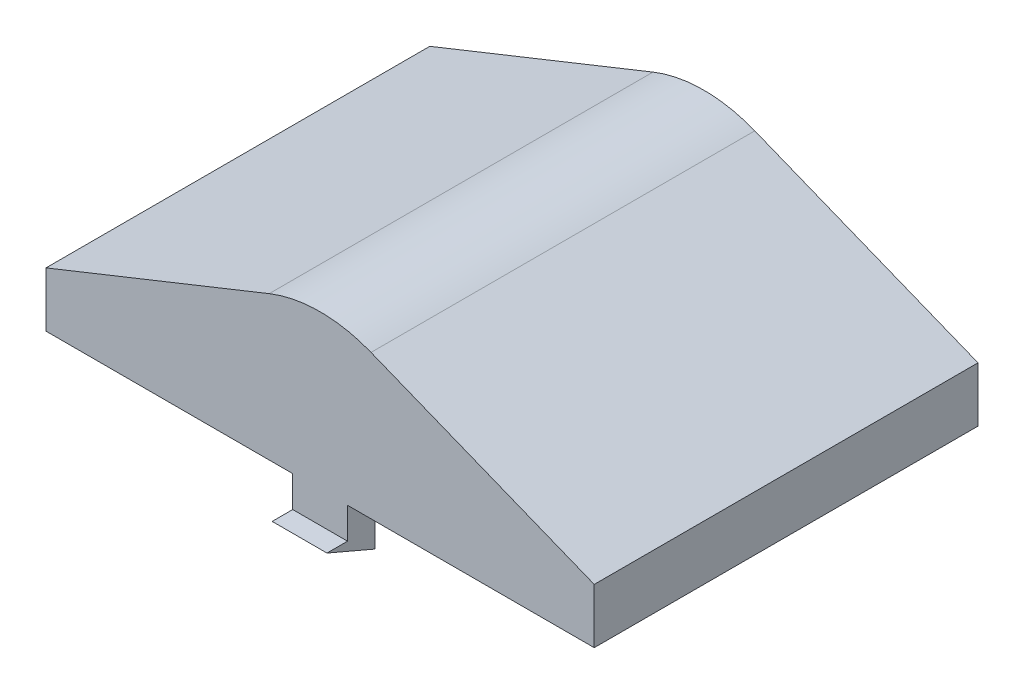
ISO-10303-21;
HEADER;
FILE_DESCRIPTION(('STEP AP214'),'2;1');
FILE_NAME('part.step','',(''),(''),'','','');
FILE_SCHEMA(('AUTOMOTIVE_DESIGN { 1 0 10303 214 1 1 1 1 }'));
ENDSEC;
DATA;
#1=APPLICATION_CONTEXT('core data for automotive mechanical design processes');
#2=APPLICATION_PROTOCOL_DEFINITION('international standard','automotive_design',2000,#1);
#3=PRODUCT_CONTEXT('',#1,'mechanical');
#4=PRODUCT('Part','Part','',(#3));
#5=PRODUCT_RELATED_PRODUCT_CATEGORY('part','',(#4));
#6=PRODUCT_DEFINITION_FORMATION('','',#4);
#7=PRODUCT_DEFINITION_CONTEXT('part definition',#1,'design');
#8=PRODUCT_DEFINITION('design','',#6,#7);
#9=PRODUCT_DEFINITION_SHAPE('','',#8);
#10=(LENGTH_UNIT() NAMED_UNIT(*) SI_UNIT(.MILLI.,.METRE.));
#11=(NAMED_UNIT(*) PLANE_ANGLE_UNIT() SI_UNIT($,.RADIAN.));
#12=(NAMED_UNIT(*) SI_UNIT($,.STERADIAN.) SOLID_ANGLE_UNIT());
#13=UNCERTAINTY_MEASURE_WITH_UNIT(LENGTH_MEASURE(1.E-05),#10,'distance_accuracy_value','');
#14=(GEOMETRIC_REPRESENTATION_CONTEXT(3) GLOBAL_UNCERTAINTY_ASSIGNED_CONTEXT((#13)) GLOBAL_UNIT_ASSIGNED_CONTEXT((#10,
#11,#12)) REPRESENTATION_CONTEXT('',''));
#15=CARTESIAN_POINT('',(0.,0.,0.));
#16=DIRECTION('',(0.,0.,1.));
#17=DIRECTION('',(1.,0.,0.));
#18=AXIS2_PLACEMENT_3D('',#15,#16,#17);
#19=CARTESIAN_POINT('',(-10.,0.,7.));
#20=DIRECTION('',(0.,1.,0.));
#21=DIRECTION('',(-1.,0.,0.));
#22=AXIS2_PLACEMENT_3D('',#19,#20,#21);
#23=PLANE('',#22);
#24=DIRECTION('',(0.,0.,-1.));
#25=VECTOR('',#24,1.);
#26=CARTESIAN_POINT('',(-0.999999999999994,0.,-6.));
#27=LINE('',#26,#25);
#28=CARTESIAN_POINT('',(-0.999999999999994,0.,-6.));
#29=VERTEX_POINT('',#28);
#30=CARTESIAN_POINT('',(-0.999999999999999,0.,-7.));
#31=VERTEX_POINT('',#30);
#32=EDGE_CURVE('E203',#29,#31,#27,.T.);
#33=ORIENTED_EDGE('',*,*,#32,.F.);
#34=DIRECTION('',(1.,0.,0.));
#35=VECTOR('',#34,1.);
#36=CARTESIAN_POINT('',(10.,0.,-6.));
#37=LINE('',#36,#35);
#38=CARTESIAN_POINT('',(-8.99999999999999,0.,-6.));
#39=VERTEX_POINT('',#38);
#40=EDGE_CURVE('E281',#39,#29,#37,.T.);
#41=ORIENTED_EDGE('',*,*,#40,.F.);
#42=DIRECTION('',(0.,0.,-1.));
#43=VECTOR('',#42,1.);
#44=CARTESIAN_POINT('',(-9.,0.,7.));
#45=LINE('',#44,#43);
#46=CARTESIAN_POINT('',(-9.,0.,6.));
#47=VERTEX_POINT('',#46);
#48=EDGE_CURVE('E304',#47,#39,#45,.T.);
#49=ORIENTED_EDGE('',*,*,#48,.F.);
#50=DIRECTION('',(1.,0.,0.));
#51=VECTOR('',#50,1.);
#52=CARTESIAN_POINT('',(10.,0.,6.));
#53=LINE('',#52,#51);
#54=CARTESIAN_POINT('',(-0.999999999999997,0.,6.));
#55=VERTEX_POINT('',#54);
#56=EDGE_CURVE('E310',#47,#55,#53,.T.);
#57=ORIENTED_EDGE('',*,*,#56,.T.);
#58=DIRECTION('',(0.,0.,1.));
#59=VECTOR('',#58,1.);
#60=CARTESIAN_POINT('',(-0.999999999999996,0.,6.));
#61=LINE('',#60,#59);
#62=CARTESIAN_POINT('',(-1.,0.,7.));
#63=VERTEX_POINT('',#62);
#64=EDGE_CURVE('E248',#55,#63,#61,.T.);
#65=ORIENTED_EDGE('',*,*,#64,.T.);
#66=DIRECTION('',(1.,0.,0.));
#67=VECTOR('',#66,1.);
#68=CARTESIAN_POINT('',(-10.,0.,7.));
#69=LINE('',#68,#67);
#70=CARTESIAN_POINT('',(-10.,0.,7.));
#71=VERTEX_POINT('',#70);
#72=EDGE_CURVE('E319',#71,#63,#69,.T.);
#73=ORIENTED_EDGE('',*,*,#72,.F.);
#74=DIRECTION('',(0.,0.,-1.));
#75=VECTOR('',#74,1.);
#76=CARTESIAN_POINT('',(-10.,0.,7.));
#77=LINE('',#76,#75);
#78=CARTESIAN_POINT('',(-9.99999999999999,0.,-7.));
#79=VERTEX_POINT('',#78);
#80=EDGE_CURVE('E343',#71,#79,#77,.T.);
#81=ORIENTED_EDGE('',*,*,#80,.T.);
#82=DIRECTION('',(1.,0.,0.));
#83=VECTOR('',#82,1.);
#84=CARTESIAN_POINT('',(-9.99999999999999,0.,-7.));
#85=LINE('',#84,#83);
#86=EDGE_CURVE('E336',#79,#31,#85,.T.);
#87=ORIENTED_EDGE('',*,*,#86,.T.);
#88=EDGE_LOOP('',(#33,#41,#49,#57,#65,#73,#81,#87));
#89=FACE_BOUND('',#88,.T.);
#90=ADVANCED_FACE('F35',(#89),#23,.F.);
#91=CARTESIAN_POINT('',(1.00000000000001,0.,-6.));
#92=VERTEX_POINT('',#91);
#93=CARTESIAN_POINT('',(9.00000000000001,0.,-6.));
#94=VERTEX_POINT('',#93);
#95=EDGE_CURVE('E306',#92,#94,#37,.T.);
#96=ORIENTED_EDGE('',*,*,#95,.F.);
#97=DIRECTION('',(0.,0.,-1.));
#98=VECTOR('',#97,1.);
#99=CARTESIAN_POINT('',(1.00000000000001,0.,-6.));
#100=LINE('',#99,#98);
#101=CARTESIAN_POINT('',(1.00000000000001,0.,-7.));
#102=VERTEX_POINT('',#101);
#103=EDGE_CURVE('E52',#92,#102,#100,.T.);
#104=ORIENTED_EDGE('',*,*,#103,.T.);
#105=CARTESIAN_POINT('',(10.,0.,-7.));
#106=VERTEX_POINT('',#105);
#107=EDGE_CURVE('E335',#102,#106,#85,.T.);
#108=ORIENTED_EDGE('',*,*,#107,.T.);
#109=DIRECTION('',(0.,0.,-1.));
#110=VECTOR('',#109,1.);
#111=CARTESIAN_POINT('',(10.,0.,7.));
#112=LINE('',#111,#110);
#113=CARTESIAN_POINT('',(10.,0.,7.));
#114=VERTEX_POINT('',#113);
#115=EDGE_CURVE('E340',#114,#106,#112,.T.);
#116=ORIENTED_EDGE('',*,*,#115,.F.);
#117=CARTESIAN_POINT('',(1.,0.,7.));
#118=VERTEX_POINT('',#117);
#119=EDGE_CURVE('E316',#118,#114,#69,.T.);
#120=ORIENTED_EDGE('',*,*,#119,.F.);
#121=DIRECTION('',(0.,0.,1.));
#122=VECTOR('',#121,1.);
#123=CARTESIAN_POINT('',(1.,0.,6.));
#124=LINE('',#123,#122);
#125=CARTESIAN_POINT('',(1.,0.,6.));
#126=VERTEX_POINT('',#125);
#127=EDGE_CURVE('E60',#126,#118,#124,.T.);
#128=ORIENTED_EDGE('',*,*,#127,.F.);
#129=CARTESIAN_POINT('',(9.,0.,6.));
#130=VERTEX_POINT('',#129);
#131=EDGE_CURVE('E237',#126,#130,#53,.T.);
#132=ORIENTED_EDGE('',*,*,#131,.T.);
#133=DIRECTION('',(0.,0.,-1.));
#134=VECTOR('',#133,1.);
#135=CARTESIAN_POINT('',(9.,0.,7.));
#136=LINE('',#135,#134);
#137=EDGE_CURVE('E308',#130,#94,#136,.T.);
#138=ORIENTED_EDGE('',*,*,#137,.T.);
#139=EDGE_LOOP('',(#96,#104,#108,#116,#120,#128,#132,#138));
#140=FACE_BOUND('',#139,.T.);
#141=ADVANCED_FACE('F412',(#140),#23,.F.);
#142=CARTESIAN_POINT('',(10.,0.,7.));
#143=DIRECTION('',(-1.,0.,0.));
#144=DIRECTION('',(0.,-1.,0.));
#145=AXIS2_PLACEMENT_3D('',#142,#143,#144);
#146=PLANE('',#145);
#147=DIRECTION('',(0.,1.,0.));
#148=VECTOR('',#147,1.);
#149=CARTESIAN_POINT('',(10.,0.,-7.));
#150=LINE('',#149,#148);
#151=CARTESIAN_POINT('',(10.,1.99999999999999,-7.));
#152=VERTEX_POINT('',#151);
#153=EDGE_CURVE('E293',#106,#152,#150,.T.);
#154=ORIENTED_EDGE('',*,*,#153,.T.);
#155=DIRECTION('',(0.,0.,-1.));
#156=VECTOR('',#155,1.);
#157=CARTESIAN_POINT('',(10.,2.,7.));
#158=LINE('',#157,#156);
#159=CARTESIAN_POINT('',(10.,2.,7.));
#160=VERTEX_POINT('',#159);
#161=EDGE_CURVE('E349',#160,#152,#158,.T.);
#162=ORIENTED_EDGE('',*,*,#161,.F.);
#163=DIRECTION('',(0.,1.,0.));
#164=VECTOR('',#163,1.);
#165=CARTESIAN_POINT('',(10.,0.,7.));
#166=LINE('',#165,#164);
#167=EDGE_CURVE('E339',#114,#160,#166,.T.);
#168=ORIENTED_EDGE('',*,*,#167,.F.);
#169=ORIENTED_EDGE('',*,*,#115,.T.);
#170=EDGE_LOOP('',(#154,#162,#168,#169));
#171=FACE_BOUND('',#170,.T.);
#172=ADVANCED_FACE('F416',(#171),#146,.F.);
#173=CARTESIAN_POINT('',(10.,2.,7.));
#174=DIRECTION('',(-0.371390676354104,-0.928476690885259,0.));
#175=DIRECTION('',(0.928476690885259,-0.371390676354104,0.));
#176=AXIS2_PLACEMENT_3D('',#173,#174,#175);
#177=PLANE('',#176);
#178=DIRECTION('',(-0.928476690885259,0.371390676354104,0.));
#179=VECTOR('',#178,1.);
#180=CARTESIAN_POINT('',(10.,1.99999999999999,-7.));
#181=LINE('',#180,#179);
#182=CARTESIAN_POINT('',(1.85695338177052,5.25721864729179,-7.));
#183=VERTEX_POINT('',#182);
#184=EDGE_CURVE('E328',#152,#183,#181,.T.);
#185=ORIENTED_EDGE('',*,*,#184,.T.);
#186=DIRECTION('',(0.,0.,-1.));
#187=VECTOR('',#186,1.);
#188=CARTESIAN_POINT('',(1.85695338177053,5.2572186472918,7.));
#189=LINE('',#188,#187);
#190=CARTESIAN_POINT('',(1.85695338177053,5.2572186472918,7.));
#191=VERTEX_POINT('',#190);
#192=EDGE_CURVE('E44',#183,#191,#189,.F.);
#193=ORIENTED_EDGE('',*,*,#192,.T.);
#194=DIRECTION('',(-0.928476690885259,0.371390676354104,0.));
#195=VECTOR('',#194,1.);
#196=CARTESIAN_POINT('',(10.,2.,7.));
#197=LINE('',#196,#195);
#198=EDGE_CURVE('E361',#160,#191,#197,.T.);
#199=ORIENTED_EDGE('',*,*,#198,.F.);
#200=ORIENTED_EDGE('',*,*,#161,.T.);
#201=EDGE_LOOP('',(#185,#193,#199,#200));
#202=FACE_BOUND('',#201,.T.);
#203=ADVANCED_FACE('F360',(#202),#177,.F.);
#204=CARTESIAN_POINT('',(-10.,2.00000000000002,7.));
#205=DIRECTION('',(0.371390676354103,-0.92847669088526,0.));
#206=DIRECTION('',(0.92847669088526,0.371390676354103,0.));
#207=AXIS2_PLACEMENT_3D('',#204,#205,#206);
#208=PLANE('',#207);
#209=DIRECTION('',(-0.92847669088526,-0.371390676354103,0.));
#210=VECTOR('',#209,1.);
#211=CARTESIAN_POINT('',(-10.,2.00000000000002,7.));
#212=LINE('',#211,#210);
#213=CARTESIAN_POINT('',(-1.85695338177051,5.2572186472918,7.));
#214=VERTEX_POINT('',#213);
#215=CARTESIAN_POINT('',(-10.,2.00000000000002,7.));
#216=VERTEX_POINT('',#215);
#217=EDGE_CURVE('E370',#214,#216,#212,.T.);
#218=ORIENTED_EDGE('',*,*,#217,.F.);
#219=DIRECTION('',(0.,0.,-1.));
#220=VECTOR('',#219,1.);
#221=CARTESIAN_POINT('',(-1.85695338177051,5.2572186472918,7.));
#222=LINE('',#221,#220);
#223=CARTESIAN_POINT('',(-1.85695338177051,5.25721864729178,-7.));
#224=VERTEX_POINT('',#223);
#225=EDGE_CURVE('E352',#214,#224,#222,.T.);
#226=ORIENTED_EDGE('',*,*,#225,.T.);
#227=DIRECTION('',(-0.92847669088526,-0.371390676354103,0.));
#228=VECTOR('',#227,1.);
#229=CARTESIAN_POINT('',(-9.99999999999999,2.00000000000001,-7.));
#230=LINE('',#229,#228);
#231=CARTESIAN_POINT('',(-9.99999999999999,2.00000000000001,-7.));
#232=VERTEX_POINT('',#231);
#233=EDGE_CURVE('E331',#224,#232,#230,.T.);
#234=ORIENTED_EDGE('',*,*,#233,.T.);
#235=DIRECTION('',(0.,0.,-1.));
#236=VECTOR('',#235,1.);
#237=CARTESIAN_POINT('',(-10.,2.00000000000002,7.));
#238=LINE('',#237,#236);
#239=EDGE_CURVE('E346',#216,#232,#238,.T.);
#240=ORIENTED_EDGE('',*,*,#239,.F.);
#241=EDGE_LOOP('',(#218,#226,#234,#240));
#242=FACE_BOUND('',#241,.T.);
#243=ADVANCED_FACE('F375',(#242),#208,.F.);
#244=CARTESIAN_POINT('',(-10.,0.,7.));
#245=DIRECTION('',(1.,0.,0.));
#246=DIRECTION('',(0.,1.,0.));
#247=AXIS2_PLACEMENT_3D('',#244,#245,#246);
#248=PLANE('',#247);
#249=DIRECTION('',(0.,-1.,0.));
#250=VECTOR('',#249,1.);
#251=CARTESIAN_POINT('',(-9.99999999999999,0.,-7.));
#252=LINE('',#251,#250);
#253=EDGE_CURVE('E333',#232,#79,#252,.T.);
#254=ORIENTED_EDGE('',*,*,#253,.T.);
#255=ORIENTED_EDGE('',*,*,#80,.F.);
#256=DIRECTION('',(0.,-1.,0.));
#257=VECTOR('',#256,1.);
#258=CARTESIAN_POINT('',(-10.,0.,7.));
#259=LINE('',#258,#257);
#260=EDGE_CURVE('E320',#216,#71,#259,.T.);
#261=ORIENTED_EDGE('',*,*,#260,.F.);
#262=ORIENTED_EDGE('',*,*,#239,.T.);
#263=EDGE_LOOP('',(#254,#255,#261,#262));
#264=FACE_BOUND('',#263,.T.);
#265=ADVANCED_FACE('F383',(#264),#248,.F.);
#266=CARTESIAN_POINT('',(10.,0.,7.));
#267=DIRECTION('',(0.,0.,-1.));
#268=DIRECTION('',(-1.,0.,0.));
#269=AXIS2_PLACEMENT_3D('',#266,#267,#268);
#270=PLANE('',#269);
#271=ORIENTED_EDGE('',*,*,#198,.T.);
#272=CARTESIAN_POINT('',(0.,0.614835192865495,7.));
#273=DIRECTION('',(0.,0.,-1.));
#274=DIRECTION('',(-1.,0.,0.));
#275=AXIS2_PLACEMENT_3D('',#272,#273,#274);
#276=CIRCLE('',#275,5.);
#277=EDGE_CURVE('E11',#191,#214,#276,.F.);
#278=ORIENTED_EDGE('',*,*,#277,.T.);
#279=ORIENTED_EDGE('',*,*,#217,.T.);
#280=ORIENTED_EDGE('',*,*,#260,.T.);
#281=ORIENTED_EDGE('',*,*,#72,.T.);
#282=DIRECTION('',(0.,-1.,0.));
#283=VECTOR('',#282,1.);
#284=CARTESIAN_POINT('',(-0.999999999999997,0.,7.));
#285=LINE('',#284,#283);
#286=CARTESIAN_POINT('',(-0.999999999999994,-1.1351648071345,7.));
#287=VERTEX_POINT('',#286);
#288=EDGE_CURVE('E251',#63,#287,#285,.T.);
#289=ORIENTED_EDGE('',*,*,#288,.T.);
#290=DIRECTION('',(-1.,0.,0.));
#291=VECTOR('',#290,1.);
#292=CARTESIAN_POINT('',(1.,-1.13516480713449,7.));
#293=LINE('',#292,#291);
#294=CARTESIAN_POINT('',(1.,-1.13516480713449,7.));
#295=VERTEX_POINT('',#294);
#296=EDGE_CURVE('E265',#295,#287,#293,.T.);
#297=ORIENTED_EDGE('',*,*,#296,.F.);
#298=DIRECTION('',(0.,-1.,0.));
#299=VECTOR('',#298,1.);
#300=CARTESIAN_POINT('',(1.,0.,7.));
#301=LINE('',#300,#299);
#302=EDGE_CURVE('E235',#118,#295,#301,.T.);
#303=ORIENTED_EDGE('',*,*,#302,.F.);
#304=ORIENTED_EDGE('',*,*,#119,.T.);
#305=ORIENTED_EDGE('',*,*,#167,.T.);
#306=EDGE_LOOP('',(#271,#278,#279,#280,#281,#289,#297,#303,#304,#305));
#307=FACE_BOUND('',#306,.T.);
#308=ADVANCED_FACE('F366',(#307),#270,.F.);
#309=CARTESIAN_POINT('',(10.,0.,-7.));
#310=DIRECTION('',(0.,0.,-1.));
#311=DIRECTION('',(-1.,0.,0.));
#312=AXIS2_PLACEMENT_3D('',#309,#310,#311);
#313=PLANE('',#312);
#314=ORIENTED_EDGE('',*,*,#233,.F.);
#315=CARTESIAN_POINT('',(0.,0.614835192865495,-7.));
#316=DIRECTION('',(0.,0.,-1.));
#317=DIRECTION('',(-1.,0.,0.));
#318=AXIS2_PLACEMENT_3D('',#315,#316,#317);
#319=CIRCLE('',#318,5.);
#320=EDGE_CURVE('E355',#224,#183,#319,.T.);
#321=ORIENTED_EDGE('',*,*,#320,.T.);
#322=ORIENTED_EDGE('',*,*,#184,.F.);
#323=ORIENTED_EDGE('',*,*,#153,.F.);
#324=ORIENTED_EDGE('',*,*,#107,.F.);
#325=DIRECTION('',(0.,-1.,0.));
#326=VECTOR('',#325,1.);
#327=CARTESIAN_POINT('',(1.00000000000001,0.,-7.));
#328=LINE('',#327,#326);
#329=CARTESIAN_POINT('',(1.00000000000001,-1.13516480713451,-7.));
#330=VERTEX_POINT('',#329);
#331=EDGE_CURVE('E208',#102,#330,#328,.T.);
#332=ORIENTED_EDGE('',*,*,#331,.T.);
#333=DIRECTION('',(-1.,0.,0.));
#334=VECTOR('',#333,1.);
#335=CARTESIAN_POINT('',(1.00000000000001,-1.13516480713451,-7.));
#336=LINE('',#335,#334);
#337=CARTESIAN_POINT('',(-0.999999999999994,-1.13516480713451,-7.));
#338=VERTEX_POINT('',#337);
#339=EDGE_CURVE('E214',#330,#338,#336,.T.);
#340=ORIENTED_EDGE('',*,*,#339,.T.);
#341=DIRECTION('',(0.,-1.,0.));
#342=VECTOR('',#341,1.);
#343=CARTESIAN_POINT('',(-0.999999999999999,0.,-7.));
#344=LINE('',#343,#342);
#345=EDGE_CURVE('E221',#31,#338,#344,.T.);
#346=ORIENTED_EDGE('',*,*,#345,.F.);
#347=ORIENTED_EDGE('',*,*,#86,.F.);
#348=ORIENTED_EDGE('',*,*,#253,.F.);
#349=EDGE_LOOP('',(#314,#321,#322,#323,#324,#332,#340,#346,#347,#348));
#350=FACE_BOUND('',#349,.T.);
#351=ADVANCED_FACE('F379',(#350),#313,.T.);
#352=CARTESIAN_POINT('',(0.,0.614835192865495,7.));
#353=DIRECTION('',(0.,0.,-1.));
#354=DIRECTION('',(-1.,0.,0.));
#355=AXIS2_PLACEMENT_3D('',#352,#353,#354);
#356=CYLINDRICAL_SURFACE('',#355,5.);
#357=ORIENTED_EDGE('',*,*,#277,.F.);
#358=ORIENTED_EDGE('',*,*,#192,.F.);
#359=ORIENTED_EDGE('',*,*,#320,.F.);
#360=ORIENTED_EDGE('',*,*,#225,.F.);
#361=EDGE_LOOP('',(#357,#358,#359,#360));
#362=FACE_BOUND('',#361,.T.);
#363=ADVANCED_FACE('F37',(#362),#356,.T.);
#364=CARTESIAN_POINT('',(9.,0.,7.));
#365=DIRECTION('',(-1.,0.,0.));
#366=DIRECTION('',(0.,-1.,0.));
#367=AXIS2_PLACEMENT_3D('',#364,#365,#366);
#368=PLANE('',#367);
#369=DIRECTION('',(0.,1.,0.));
#370=VECTOR('',#369,1.);
#371=CARTESIAN_POINT('',(9.00000000000001,0.,-6.));
#372=LINE('',#371,#370);
#373=CARTESIAN_POINT('',(9.00000000000001,1.32296703857309,-6.));
#374=VERTEX_POINT('',#373);
#375=EDGE_CURVE('E268',#94,#374,#372,.T.);
#376=ORIENTED_EDGE('',*,*,#375,.F.);
#377=ORIENTED_EDGE('',*,*,#137,.F.);
#378=DIRECTION('',(0.,1.,0.));
#379=VECTOR('',#378,1.);
#380=CARTESIAN_POINT('',(9.,0.,6.));
#381=LINE('',#380,#379);
#382=CARTESIAN_POINT('',(9.,1.3229670385731,6.));
#383=VERTEX_POINT('',#382);
#384=EDGE_CURVE('E277',#130,#383,#381,.T.);
#385=ORIENTED_EDGE('',*,*,#384,.T.);
#386=DIRECTION('',(0.,0.,-1.));
#387=VECTOR('',#386,1.);
#388=CARTESIAN_POINT('',(9.,1.3229670385731,7.));
#389=LINE('',#388,#387);
#390=EDGE_CURVE('E272',#383,#374,#389,.T.);
#391=ORIENTED_EDGE('',*,*,#390,.T.);
#392=EDGE_LOOP('',(#376,#377,#385,#391));
#393=FACE_BOUND('',#392,.T.);
#394=ADVANCED_FACE('F422',(#393),#368,.T.);
#395=CARTESIAN_POINT('',(9.6286093236459,1.07152330911474,7.));
#396=DIRECTION('',(-0.371390676354104,-0.928476690885259,0.));
#397=DIRECTION('',(0.928476690885259,-0.371390676354104,0.));
#398=AXIS2_PLACEMENT_3D('',#395,#396,#397);
#399=PLANE('',#398);
#400=DIRECTION('',(-0.928476690885259,0.371390676354104,0.));
#401=VECTOR('',#400,1.);
#402=CARTESIAN_POINT('',(10.3182644960597,0.795661240149209,-6.));
#403=LINE('',#402,#401);
#404=CARTESIAN_POINT('',(1.48556270541642,4.32874195640653,-6.));
#405=VERTEX_POINT('',#404);
#406=EDGE_CURVE('E271',#374,#405,#403,.T.);
#407=ORIENTED_EDGE('',*,*,#406,.F.);
#408=ORIENTED_EDGE('',*,*,#390,.F.);
#409=DIRECTION('',(-0.928476690885259,0.371390676354104,0.));
#410=VECTOR('',#409,1.);
#411=CARTESIAN_POINT('',(10.3182644960597,0.795661240149223,6.));
#412=LINE('',#411,#410);
#413=CARTESIAN_POINT('',(1.48556270541643,4.32874195640654,6.));
#414=VERTEX_POINT('',#413);
#415=EDGE_CURVE('E280',#383,#414,#412,.T.);
#416=ORIENTED_EDGE('',*,*,#415,.T.);
#417=DIRECTION('',(0.,0.,1.));
#418=VECTOR('',#417,1.);
#419=CARTESIAN_POINT('',(1.48556270541643,4.32874195640654,7.));
#420=LINE('',#419,#418);
#421=EDGE_CURVE('E285',#405,#414,#420,.T.);
#422=ORIENTED_EDGE('',*,*,#421,.F.);
#423=EDGE_LOOP('',(#407,#408,#416,#422));
#424=FACE_BOUND('',#423,.T.);
#425=ADVANCED_FACE('F429',(#424),#399,.T.);
#426=CARTESIAN_POINT('',(-9.6286093236459,1.07152330911476,7.));
#427=DIRECTION('',(0.371390676354103,-0.92847669088526,0.));
#428=DIRECTION('',(0.92847669088526,0.371390676354103,0.));
#429=AXIS2_PLACEMENT_3D('',#426,#427,#428);
#430=PLANE('',#429);
#431=DIRECTION('',(-0.92847669088526,-0.371390676354103,0.));
#432=VECTOR('',#431,1.);
#433=CARTESIAN_POINT('',(6.92311481428515,7.69221296428716,6.));
#434=LINE('',#433,#432);
#435=CARTESIAN_POINT('',(-1.48556270541641,4.32874195640653,6.));
#436=VERTEX_POINT('',#435);
#437=CARTESIAN_POINT('',(-8.99999999999999,1.32296703857312,6.));
#438=VERTEX_POINT('',#437);
#439=EDGE_CURVE('E291',#436,#438,#434,.T.);
#440=ORIENTED_EDGE('',*,*,#439,.T.);
#441=DIRECTION('',(0.,0.,-1.));
#442=VECTOR('',#441,1.);
#443=CARTESIAN_POINT('',(-8.99999999999999,1.32296703857312,7.));
#444=LINE('',#443,#442);
#445=CARTESIAN_POINT('',(-8.99999999999999,1.32296703857311,-6.));
#446=VERTEX_POINT('',#445);
#447=EDGE_CURVE('E276',#438,#446,#444,.T.);
#448=ORIENTED_EDGE('',*,*,#447,.T.);
#449=DIRECTION('',(-0.92847669088526,-0.371390676354103,0.));
#450=VECTOR('',#449,1.);
#451=CARTESIAN_POINT('',(6.92311481428516,7.69221296428715,-6.));
#452=LINE('',#451,#450);
#453=CARTESIAN_POINT('',(-1.48556270541641,4.32874195640653,-6.));
#454=VERTEX_POINT('',#453);
#455=EDGE_CURVE('E284',#454,#446,#452,.T.);
#456=ORIENTED_EDGE('',*,*,#455,.F.);
#457=DIRECTION('',(0.,0.,1.));
#458=VECTOR('',#457,1.);
#459=CARTESIAN_POINT('',(-1.48556270541641,4.32874195640653,7.));
#460=LINE('',#459,#458);
#461=EDGE_CURVE('E275',#436,#454,#460,.F.);
#462=ORIENTED_EDGE('',*,*,#461,.F.);
#463=EDGE_LOOP('',(#440,#448,#456,#462));
#464=FACE_BOUND('',#463,.T.);
#465=ADVANCED_FACE('F437',(#464),#430,.T.);
#466=CARTESIAN_POINT('',(-9.,0.,7.));
#467=DIRECTION('',(1.,0.,0.));
#468=DIRECTION('',(0.,1.,0.));
#469=AXIS2_PLACEMENT_3D('',#466,#467,#468);
#470=PLANE('',#469);
#471=DIRECTION('',(0.,-1.,0.));
#472=VECTOR('',#471,1.);
#473=CARTESIAN_POINT('',(-8.99999999999999,0.,-6.));
#474=LINE('',#473,#472);
#475=EDGE_CURVE('E301',#446,#39,#474,.T.);
#476=ORIENTED_EDGE('',*,*,#475,.F.);
#477=ORIENTED_EDGE('',*,*,#447,.F.);
#478=DIRECTION('',(0.,-1.,0.));
#479=VECTOR('',#478,1.);
#480=CARTESIAN_POINT('',(-9.,0.,6.));
#481=LINE('',#480,#479);
#482=EDGE_CURVE('E295',#438,#47,#481,.T.);
#483=ORIENTED_EDGE('',*,*,#482,.T.);
#484=ORIENTED_EDGE('',*,*,#48,.T.);
#485=EDGE_LOOP('',(#476,#477,#483,#484));
#486=FACE_BOUND('',#485,.T.);
#487=ADVANCED_FACE('F443',(#486),#470,.T.);
#488=CARTESIAN_POINT('',(10.,0.,6.));
#489=DIRECTION('',(0.,0.,-1.));
#490=DIRECTION('',(-1.,0.,0.));
#491=AXIS2_PLACEMENT_3D('',#488,#489,#490);
#492=PLANE('',#491);
#493=ORIENTED_EDGE('',*,*,#415,.F.);
#494=ORIENTED_EDGE('',*,*,#384,.F.);
#495=ORIENTED_EDGE('',*,*,#131,.F.);
#496=DIRECTION('',(0.,1.,0.));
#497=VECTOR('',#496,1.);
#498=CARTESIAN_POINT('',(1.,0.,6.));
#499=LINE('',#498,#497);
#500=CARTESIAN_POINT('',(1.,-1.88516480713449,6.));
#501=VERTEX_POINT('',#500);
#502=EDGE_CURVE('E236',#501,#126,#499,.T.);
#503=ORIENTED_EDGE('',*,*,#502,.F.);
#504=DIRECTION('',(-1.,0.,0.));
#505=VECTOR('',#504,1.);
#506=CARTESIAN_POINT('',(1.,-1.88516480713449,6.));
#507=LINE('',#506,#505);
#508=CARTESIAN_POINT('',(-0.999999999999994,-1.8851648071345,6.));
#509=VERTEX_POINT('',#508);
#510=EDGE_CURVE('E259',#501,#509,#507,.T.);
#511=ORIENTED_EDGE('',*,*,#510,.T.);
#512=DIRECTION('',(0.,1.,0.));
#513=VECTOR('',#512,1.);
#514=CARTESIAN_POINT('',(-0.999999999999996,0.,6.));
#515=LINE('',#514,#513);
#516=EDGE_CURVE('E195',#509,#55,#515,.T.);
#517=ORIENTED_EDGE('',*,*,#516,.T.);
#518=ORIENTED_EDGE('',*,*,#56,.F.);
#519=ORIENTED_EDGE('',*,*,#482,.F.);
#520=ORIENTED_EDGE('',*,*,#439,.F.);
#521=CARTESIAN_POINT('',(0.,0.614835192865509,6.));
#522=DIRECTION('',(0.,0.,-1.));
#523=DIRECTION('',(-1.,0.,0.));
#524=AXIS2_PLACEMENT_3D('',#521,#522,#523);
#525=CIRCLE('',#524,4.);
#526=EDGE_CURVE('E287',#414,#436,#525,.F.);
#527=ORIENTED_EDGE('',*,*,#526,.F.);
#528=EDGE_LOOP('',(#493,#494,#495,#503,#511,#517,#518,#519,#520,#527));
#529=FACE_BOUND('',#528,.T.);
#530=ADVANCED_FACE('F426',(#529),#492,.T.);
#531=CARTESIAN_POINT('',(10.,0.,-6.));
#532=DIRECTION('',(0.,0.,-1.));
#533=DIRECTION('',(-1.,0.,0.));
#534=AXIS2_PLACEMENT_3D('',#531,#532,#533);
#535=PLANE('',#534);
#536=ORIENTED_EDGE('',*,*,#455,.T.);
#537=ORIENTED_EDGE('',*,*,#475,.T.);
#538=ORIENTED_EDGE('',*,*,#40,.T.);
#539=DIRECTION('',(0.,1.,0.));
#540=VECTOR('',#539,1.);
#541=CARTESIAN_POINT('',(-0.999999999999994,0.,-6.));
#542=LINE('',#541,#540);
#543=CARTESIAN_POINT('',(-0.999999999999992,-1.88516480713451,-6.));
#544=VERTEX_POINT('',#543);
#545=EDGE_CURVE('E190',#544,#29,#542,.T.);
#546=ORIENTED_EDGE('',*,*,#545,.F.);
#547=DIRECTION('',(-1.,0.,0.));
#548=VECTOR('',#547,1.);
#549=CARTESIAN_POINT('',(1.,-1.88516480713451,-6.));
#550=LINE('',#549,#548);
#551=CARTESIAN_POINT('',(1.,-1.88516480713451,-6.));
#552=VERTEX_POINT('',#551);
#553=EDGE_CURVE('E185',#552,#544,#550,.T.);
#554=ORIENTED_EDGE('',*,*,#553,.F.);
#555=DIRECTION('',(0.,1.,0.));
#556=VECTOR('',#555,1.);
#557=CARTESIAN_POINT('',(1.00000000000001,0.,-6.));
#558=LINE('',#557,#556);
#559=EDGE_CURVE('E187',#552,#92,#558,.T.);
#560=ORIENTED_EDGE('',*,*,#559,.T.);
#561=ORIENTED_EDGE('',*,*,#95,.T.);
#562=ORIENTED_EDGE('',*,*,#375,.T.);
#563=ORIENTED_EDGE('',*,*,#406,.T.);
#564=CARTESIAN_POINT('',(0.,0.614835192865495,-6.));
#565=DIRECTION('',(0.,0.,-1.));
#566=DIRECTION('',(-1.,0.,0.));
#567=AXIS2_PLACEMENT_3D('',#564,#565,#566);
#568=CIRCLE('',#567,4.);
#569=EDGE_CURVE('E288',#454,#405,#568,.T.);
#570=ORIENTED_EDGE('',*,*,#569,.F.);
#571=EDGE_LOOP('',(#536,#537,#538,#546,#554,#560,#561,#562,#563,#570));
#572=FACE_BOUND('',#571,.T.);
#573=ADVANCED_FACE('F186',(#572),#535,.F.);
#574=CARTESIAN_POINT('',(0.,0.614835192865495,7.));
#575=DIRECTION('',(0.,0.,-1.));
#576=DIRECTION('',(-1.,0.,0.));
#577=AXIS2_PLACEMENT_3D('',#574,#575,#576);
#578=CYLINDRICAL_SURFACE('',#577,4.);
#579=ORIENTED_EDGE('',*,*,#526,.T.);
#580=ORIENTED_EDGE('',*,*,#461,.T.);
#581=ORIENTED_EDGE('',*,*,#569,.T.);
#582=ORIENTED_EDGE('',*,*,#421,.T.);
#583=EDGE_LOOP('',(#579,#580,#581,#582));
#584=FACE_BOUND('',#583,.T.);
#585=ADVANCED_FACE('F434',(#584),#578,.F.);
#586=CARTESIAN_POINT('',(1.,-1.13516480713449,7.75));
#587=DIRECTION('',(0.,-1.,0.));
#588=DIRECTION('',(0.,0.,-1.));
#589=AXIS2_PLACEMENT_3D('',#586,#587,#588);
#590=PLANE('',#589);
#591=DIRECTION('',(0.,0.,1.));
#592=VECTOR('',#591,1.);
#593=CARTESIAN_POINT('',(-0.999999999999994,-1.1351648071345,7.75));
#594=LINE('',#593,#592);
#595=CARTESIAN_POINT('',(-0.999999999999994,-1.1351648071345,7.75));
#596=VERTEX_POINT('',#595);
#597=EDGE_CURVE('E256',#287,#596,#594,.T.);
#598=ORIENTED_EDGE('',*,*,#597,.T.);
#599=DIRECTION('',(-1.,0.,0.));
#600=VECTOR('',#599,1.);
#601=CARTESIAN_POINT('',(1.,-1.13516480713449,7.75));
#602=LINE('',#601,#600);
#603=CARTESIAN_POINT('',(1.,-1.13516480713449,7.75));
#604=VERTEX_POINT('',#603);
#605=EDGE_CURVE('E262',#604,#596,#602,.T.);
#606=ORIENTED_EDGE('',*,*,#605,.F.);
#607=DIRECTION('',(0.,0.,1.));
#608=VECTOR('',#607,1.);
#609=CARTESIAN_POINT('',(1.,-1.13516480713449,7.75));
#610=LINE('',#609,#608);
#611=EDGE_CURVE('E230',#295,#604,#610,.T.);
#612=ORIENTED_EDGE('',*,*,#611,.F.);
#613=ORIENTED_EDGE('',*,*,#296,.T.);
#614=EDGE_LOOP('',(#598,#606,#612,#613));
#615=FACE_BOUND('',#614,.T.);
#616=ADVANCED_FACE('F401',(#615),#590,.F.);
#617=CARTESIAN_POINT('',(1.,-1.88516480713449,6.));
#618=DIRECTION('',(0.,0.919145030018058,-0.393919298579168));
#619=DIRECTION('',(0.,0.393919298579168,0.919145030018058));
#620=AXIS2_PLACEMENT_3D('',#617,#618,#619);
#621=PLANE('',#620);
#622=DIRECTION('',(0.,-0.393919298579168,-0.919145030018058));
#623=VECTOR('',#622,1.);
#624=CARTESIAN_POINT('',(-0.999999999999994,-1.8851648071345,6.));
#625=LINE('',#624,#623);
#626=EDGE_CURVE('E245',#596,#509,#625,.T.);
#627=ORIENTED_EDGE('',*,*,#626,.T.);
#628=ORIENTED_EDGE('',*,*,#510,.F.);
#629=DIRECTION('',(0.,-0.393919298579168,-0.919145030018058));
#630=VECTOR('',#629,1.);
#631=CARTESIAN_POINT('',(1.,-1.88516480713449,6.));
#632=LINE('',#631,#630);
#633=EDGE_CURVE('E255',#604,#501,#632,.T.);
#634=ORIENTED_EDGE('',*,*,#633,.F.);
#635=ORIENTED_EDGE('',*,*,#605,.T.);
#636=EDGE_LOOP('',(#627,#628,#634,#635));
#637=FACE_BOUND('',#636,.T.);
#638=ADVANCED_FACE('F405',(#637),#621,.F.);
#639=CARTESIAN_POINT('',(1.,-1.13516480713449,6.));
#640=DIRECTION('',(1.,0.,0.));
#641=DIRECTION('',(0.,0.,-1.));
#642=AXIS2_PLACEMENT_3D('',#639,#640,#641);
#643=PLANE('',#642);
#644=ORIENTED_EDGE('',*,*,#502,.T.);
#645=ORIENTED_EDGE('',*,*,#127,.T.);
#646=ORIENTED_EDGE('',*,*,#302,.T.);
#647=ORIENTED_EDGE('',*,*,#611,.T.);
#648=ORIENTED_EDGE('',*,*,#633,.T.);
#649=EDGE_LOOP('',(#644,#645,#646,#647,#648));
#650=FACE_BOUND('',#649,.T.);
#651=ADVANCED_FACE('F409',(#650),#643,.T.);
#652=CARTESIAN_POINT('',(-0.999999999999994,-1.1351648071345,6.));
#653=DIRECTION('',(1.,0.,0.));
#654=DIRECTION('',(0.,0.,-1.));
#655=AXIS2_PLACEMENT_3D('',#652,#653,#654);
#656=PLANE('',#655);
#657=ORIENTED_EDGE('',*,*,#516,.F.);
#658=ORIENTED_EDGE('',*,*,#626,.F.);
#659=ORIENTED_EDGE('',*,*,#597,.F.);
#660=ORIENTED_EDGE('',*,*,#288,.F.);
#661=ORIENTED_EDGE('',*,*,#64,.F.);
#662=EDGE_LOOP('',(#657,#658,#659,#660,#661));
#663=FACE_BOUND('',#662,.T.);
#664=ADVANCED_FACE('F395',(#663),#656,.F.);
#665=CARTESIAN_POINT('',(1.,-1.88516480713451,-6.));
#666=DIRECTION('',(0.,-0.919145030018058,-0.393919298579168));
#667=DIRECTION('',(0.,0.393919298579168,-0.919145030018058));
#668=AXIS2_PLACEMENT_3D('',#665,#666,#667);
#669=PLANE('',#668);
#670=DIRECTION('',(0.,-0.393919298579168,0.919145030018058));
#671=VECTOR('',#670,1.);
#672=CARTESIAN_POINT('',(-0.999999999999992,-1.88516480713451,-6.));
#673=LINE('',#672,#671);
#674=CARTESIAN_POINT('',(-0.999999999999994,-1.13516480713451,-7.75));
#675=VERTEX_POINT('',#674);
#676=EDGE_CURVE('E216',#675,#544,#673,.T.);
#677=ORIENTED_EDGE('',*,*,#676,.F.);
#678=DIRECTION('',(-1.,0.,0.));
#679=VECTOR('',#678,1.);
#680=CARTESIAN_POINT('',(1.00000000000001,-1.13516480713451,-7.75));
#681=LINE('',#680,#679);
#682=CARTESIAN_POINT('',(1.00000000000001,-1.13516480713451,-7.75));
#683=VERTEX_POINT('',#682);
#684=EDGE_CURVE('E196',#683,#675,#681,.T.);
#685=ORIENTED_EDGE('',*,*,#684,.F.);
#686=DIRECTION('',(0.,-0.393919298579168,0.919145030018058));
#687=VECTOR('',#686,1.);
#688=CARTESIAN_POINT('',(1.,-1.88516480713451,-6.));
#689=LINE('',#688,#687);
#690=EDGE_CURVE('E201',#683,#552,#689,.T.);
#691=ORIENTED_EDGE('',*,*,#690,.T.);
#692=ORIENTED_EDGE('',*,*,#553,.T.);
#693=EDGE_LOOP('',(#677,#685,#691,#692));
#694=FACE_BOUND('',#693,.T.);
#695=ADVANCED_FACE('F205',(#694),#669,.T.);
#696=CARTESIAN_POINT('',(1.00000000000001,-1.13516480713451,-7.75));
#697=DIRECTION('',(0.,1.,0.));
#698=DIRECTION('',(0.,0.,1.));
#699=AXIS2_PLACEMENT_3D('',#696,#697,#698);
#700=PLANE('',#699);
#701=DIRECTION('',(0.,0.,-1.));
#702=VECTOR('',#701,1.);
#703=CARTESIAN_POINT('',(-0.999999999999994,-1.13516480713451,-7.75));
#704=LINE('',#703,#702);
#705=EDGE_CURVE('E218',#338,#675,#704,.T.);
#706=ORIENTED_EDGE('',*,*,#705,.F.);
#707=ORIENTED_EDGE('',*,*,#339,.F.);
#708=DIRECTION('',(0.,0.,-1.));
#709=VECTOR('',#708,1.);
#710=CARTESIAN_POINT('',(1.00000000000001,-1.13516480713451,-7.75));
#711=LINE('',#710,#709);
#712=EDGE_CURVE('E206',#330,#683,#711,.T.);
#713=ORIENTED_EDGE('',*,*,#712,.T.);
#714=ORIENTED_EDGE('',*,*,#684,.T.);
#715=EDGE_LOOP('',(#706,#707,#713,#714));
#716=FACE_BOUND('',#715,.T.);
#717=ADVANCED_FACE('F449',(#716),#700,.T.);
#718=CARTESIAN_POINT('',(1.00000000000001,-1.13516480713451,-6.));
#719=DIRECTION('',(1.,0.,0.));
#720=DIRECTION('',(0.,0.,1.));
#721=AXIS2_PLACEMENT_3D('',#718,#719,#720);
#722=PLANE('',#721);
#723=ORIENTED_EDGE('',*,*,#559,.F.);
#724=ORIENTED_EDGE('',*,*,#690,.F.);
#725=ORIENTED_EDGE('',*,*,#712,.F.);
#726=ORIENTED_EDGE('',*,*,#331,.F.);
#727=ORIENTED_EDGE('',*,*,#103,.F.);
#728=EDGE_LOOP('',(#723,#724,#725,#726,#727));
#729=FACE_BOUND('',#728,.T.);
#730=ADVANCED_FACE('F199',(#729),#722,.T.);
#731=CARTESIAN_POINT('',(-0.999999999999994,-1.13516480713451,-6.));
#732=DIRECTION('',(1.,0.,0.));
#733=DIRECTION('',(0.,0.,1.));
#734=AXIS2_PLACEMENT_3D('',#731,#732,#733);
#735=PLANE('',#734);
#736=ORIENTED_EDGE('',*,*,#545,.T.);
#737=ORIENTED_EDGE('',*,*,#32,.T.);
#738=ORIENTED_EDGE('',*,*,#345,.T.);
#739=ORIENTED_EDGE('',*,*,#705,.T.);
#740=ORIENTED_EDGE('',*,*,#676,.T.);
#741=EDGE_LOOP('',(#736,#737,#738,#739,#740));
#742=FACE_BOUND('',#741,.T.);
#743=ADVANCED_FACE('F446',(#742),#735,.F.);
#744=CLOSED_SHELL('',(#90,#141,#172,#203,#243,#265,#308,#351,#363,#394,#425,#465,#487,#530,#573,
#585,#616,#638,#651,#664,#695,#717,#730,#743));
#745=MANIFOLD_SOLID_BREP('B2',#744);
#746=ADVANCED_BREP_SHAPE_REPRESENTATION('',(#18,#745),#14);
#747=SHAPE_DEFINITION_REPRESENTATION(#9,#746);
ENDSEC;
END-ISO-10303-21;
